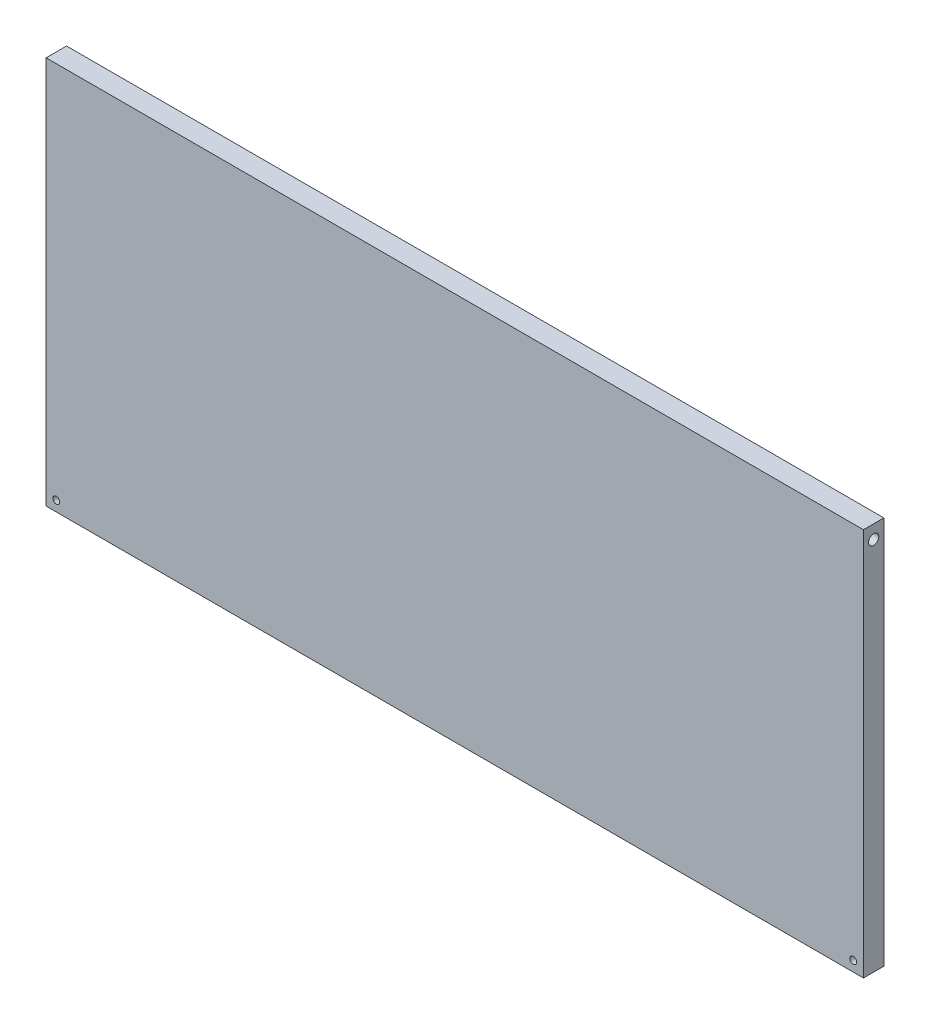
ISO-10303-21;
HEADER;
FILE_DESCRIPTION(('STEP AP214'),'2;1');
FILE_NAME('part.step','',(''),(''),'','','');
FILE_SCHEMA(('AUTOMOTIVE_DESIGN { 1 0 10303 214 1 1 1 1 }'));
ENDSEC;
DATA;
#1=APPLICATION_CONTEXT('core data for automotive mechanical design processes');
#2=APPLICATION_PROTOCOL_DEFINITION('international standard','automotive_design',2000,#1);
#3=PRODUCT_CONTEXT('',#1,'mechanical');
#4=PRODUCT('Part','Part','',(#3));
#5=PRODUCT_RELATED_PRODUCT_CATEGORY('part','',(#4));
#6=PRODUCT_DEFINITION_FORMATION('','',#4);
#7=PRODUCT_DEFINITION_CONTEXT('part definition',#1,'design');
#8=PRODUCT_DEFINITION('design','',#6,#7);
#9=PRODUCT_DEFINITION_SHAPE('','',#8);
#10=(LENGTH_UNIT() NAMED_UNIT(*) SI_UNIT(.MILLI.,.METRE.));
#11=(NAMED_UNIT(*) PLANE_ANGLE_UNIT() SI_UNIT($,.RADIAN.));
#12=(NAMED_UNIT(*) SI_UNIT($,.STERADIAN.) SOLID_ANGLE_UNIT());
#13=UNCERTAINTY_MEASURE_WITH_UNIT(LENGTH_MEASURE(1.E-05),#10,'distance_accuracy_value','');
#14=(GEOMETRIC_REPRESENTATION_CONTEXT(3) GLOBAL_UNCERTAINTY_ASSIGNED_CONTEXT((#13)) GLOBAL_UNIT_ASSIGNED_CONTEXT((#10,
#11,#12)) REPRESENTATION_CONTEXT('',''));
#15=CARTESIAN_POINT('',(0.,0.,0.));
#16=DIRECTION('',(0.,0.,1.));
#17=DIRECTION('',(1.,0.,0.));
#18=AXIS2_PLACEMENT_3D('',#15,#16,#17);
#19=CARTESIAN_POINT('',(0.,0.,3.));
#20=DIRECTION('',(1.,0.,0.));
#21=DIRECTION('',(0.,0.,-1.));
#22=AXIS2_PLACEMENT_3D('',#19,#20,#21);
#23=PLANE('',#22);
#24=CARTESIAN_POINT('',(0.,55.,1.5));
#25=DIRECTION('',(1.,0.,0.));
#26=DIRECTION('',(0.,0.,-1.));
#27=AXIS2_PLACEMENT_3D('',#24,#25,#26);
#28=CIRCLE('',#27,0.750000000000001);
#29=CARTESIAN_POINT('',(0.,55.,0.749999999999999));
#30=VERTEX_POINT('',#29);
#31=EDGE_CURVE('E113',#30,#30,#28,.T.);
#32=ORIENTED_EDGE('',*,*,#31,.T.);
#33=EDGE_LOOP('',(#32));
#34=FACE_BOUND('',#33,.T.);
#35=DIRECTION('',(0.,-1.,0.));
#36=VECTOR('',#35,1.);
#37=CARTESIAN_POINT('',(0.,0.,0.));
#38=LINE('',#37,#36);
#39=CARTESIAN_POINT('',(0.,57.,0.));
#40=VERTEX_POINT('',#39);
#41=CARTESIAN_POINT('',(0.,0.,0.));
#42=VERTEX_POINT('',#41);
#43=EDGE_CURVE('E109',#40,#42,#38,.T.);
#44=ORIENTED_EDGE('',*,*,#43,.T.);
#45=DIRECTION('',(0.,0.,-1.));
#46=VECTOR('',#45,1.);
#47=CARTESIAN_POINT('',(0.,0.,3.));
#48=LINE('',#47,#46);
#49=CARTESIAN_POINT('',(0.,0.,3.));
#50=VERTEX_POINT('',#49);
#51=EDGE_CURVE('E11',#50,#42,#48,.T.);
#52=ORIENTED_EDGE('',*,*,#51,.F.);
#53=DIRECTION('',(0.,-1.,0.));
#54=VECTOR('',#53,1.);
#55=CARTESIAN_POINT('',(0.,0.,3.));
#56=LINE('',#55,#54);
#57=CARTESIAN_POINT('',(0.,57.,3.));
#58=VERTEX_POINT('',#57);
#59=EDGE_CURVE('E92',#58,#50,#56,.T.);
#60=ORIENTED_EDGE('',*,*,#59,.F.);
#61=DIRECTION('',(0.,0.,-1.));
#62=VECTOR('',#61,1.);
#63=CARTESIAN_POINT('',(0.,57.,3.));
#64=LINE('',#63,#62);
#65=EDGE_CURVE('E105',#58,#40,#64,.T.);
#66=ORIENTED_EDGE('',*,*,#65,.T.);
#67=EDGE_LOOP('',(#44,#52,#60,#66));
#68=FACE_BOUND('',#67,.T.);
#69=ADVANCED_FACE('F38',(#34,#68),#23,.F.);
#70=CARTESIAN_POINT('',(0.,0.,3.));
#71=DIRECTION('',(0.,1.,0.));
#72=DIRECTION('',(0.,0.,1.));
#73=AXIS2_PLACEMENT_3D('',#70,#71,#72);
#74=PLANE('',#73);
#75=DIRECTION('',(1.,0.,0.));
#76=VECTOR('',#75,1.);
#77=CARTESIAN_POINT('',(0.,0.,0.));
#78=LINE('',#77,#76);
#79=CARTESIAN_POINT('',(120.,0.,0.));
#80=VERTEX_POINT('',#79);
#81=EDGE_CURVE('E97',#42,#80,#78,.T.);
#82=ORIENTED_EDGE('',*,*,#81,.T.);
#83=DIRECTION('',(0.,0.,-1.));
#84=VECTOR('',#83,1.);
#85=CARTESIAN_POINT('',(120.,0.,3.));
#86=LINE('',#85,#84);
#87=CARTESIAN_POINT('',(120.,0.,3.));
#88=VERTEX_POINT('',#87);
#89=EDGE_CURVE('E48',#88,#80,#86,.T.);
#90=ORIENTED_EDGE('',*,*,#89,.F.);
#91=DIRECTION('',(1.,0.,0.));
#92=VECTOR('',#91,1.);
#93=CARTESIAN_POINT('',(0.,0.,3.));
#94=LINE('',#93,#92);
#95=EDGE_CURVE('E87',#50,#88,#94,.T.);
#96=ORIENTED_EDGE('',*,*,#95,.F.);
#97=ORIENTED_EDGE('',*,*,#51,.T.);
#98=EDGE_LOOP('',(#82,#90,#96,#97));
#99=FACE_BOUND('',#98,.T.);
#100=ADVANCED_FACE('F96',(#99),#74,.F.);
#101=CARTESIAN_POINT('',(120.,0.,3.));
#102=DIRECTION('',(-1.,0.,0.));
#103=DIRECTION('',(0.,0.,1.));
#104=AXIS2_PLACEMENT_3D('',#101,#102,#103);
#105=PLANE('',#104);
#106=CARTESIAN_POINT('',(120.,55.,1.5));
#107=DIRECTION('',(1.,0.,0.));
#108=DIRECTION('',(0.,0.,-1.));
#109=AXIS2_PLACEMENT_3D('',#106,#107,#108);
#110=CIRCLE('',#109,0.750000000000001);
#111=CARTESIAN_POINT('',(120.,55.,0.749999999999999));
#112=VERTEX_POINT('',#111);
#113=EDGE_CURVE('E132',#112,#112,#110,.T.);
#114=ORIENTED_EDGE('',*,*,#113,.F.);
#115=EDGE_LOOP('',(#114));
#116=FACE_BOUND('',#115,.T.);
#117=DIRECTION('',(0.,1.,0.));
#118=VECTOR('',#117,1.);
#119=CARTESIAN_POINT('',(120.,0.,0.));
#120=LINE('',#119,#118);
#121=CARTESIAN_POINT('',(120.,57.,0.));
#122=VERTEX_POINT('',#121);
#123=EDGE_CURVE('E74',#80,#122,#120,.T.);
#124=ORIENTED_EDGE('',*,*,#123,.T.);
#125=DIRECTION('',(0.,0.,-1.));
#126=VECTOR('',#125,1.);
#127=CARTESIAN_POINT('',(120.,57.,3.));
#128=LINE('',#127,#126);
#129=CARTESIAN_POINT('',(120.,57.,3.));
#130=VERTEX_POINT('',#129);
#131=EDGE_CURVE('E99',#130,#122,#128,.T.);
#132=ORIENTED_EDGE('',*,*,#131,.F.);
#133=DIRECTION('',(0.,1.,0.));
#134=VECTOR('',#133,1.);
#135=CARTESIAN_POINT('',(120.,0.,3.));
#136=LINE('',#135,#134);
#137=EDGE_CURVE('E90',#88,#130,#136,.T.);
#138=ORIENTED_EDGE('',*,*,#137,.F.);
#139=ORIENTED_EDGE('',*,*,#89,.T.);
#140=EDGE_LOOP('',(#124,#132,#138,#139));
#141=FACE_BOUND('',#140,.T.);
#142=ADVANCED_FACE('F101',(#116,#141),#105,.F.);
#143=CARTESIAN_POINT('',(0.,57.,3.));
#144=DIRECTION('',(0.,-1.,0.));
#145=DIRECTION('',(0.,0.,-1.));
#146=AXIS2_PLACEMENT_3D('',#143,#144,#145);
#147=PLANE('',#146);
#148=DIRECTION('',(-1.,0.,0.));
#149=VECTOR('',#148,1.);
#150=CARTESIAN_POINT('',(0.,57.,0.));
#151=LINE('',#150,#149);
#152=EDGE_CURVE('E80',#122,#40,#151,.T.);
#153=ORIENTED_EDGE('',*,*,#152,.T.);
#154=ORIENTED_EDGE('',*,*,#65,.F.);
#155=DIRECTION('',(-1.,0.,0.));
#156=VECTOR('',#155,1.);
#157=CARTESIAN_POINT('',(0.,57.,3.));
#158=LINE('',#157,#156);
#159=EDGE_CURVE('E57',#130,#58,#158,.T.);
#160=ORIENTED_EDGE('',*,*,#159,.F.);
#161=ORIENTED_EDGE('',*,*,#131,.T.);
#162=EDGE_LOOP('',(#153,#154,#160,#161));
#163=FACE_BOUND('',#162,.T.);
#164=ADVANCED_FACE('F175',(#163),#147,.F.);
#165=CARTESIAN_POINT('',(0.,0.,3.));
#166=DIRECTION('',(0.,0.,-1.));
#167=DIRECTION('',(-1.,0.,0.));
#168=AXIS2_PLACEMENT_3D('',#165,#166,#167);
#169=PLANE('',#168);
#170=CARTESIAN_POINT('',(1.5,1.5,3.));
#171=DIRECTION('',(0.,0.,1.));
#172=DIRECTION('',(1.,0.,0.));
#173=AXIS2_PLACEMENT_3D('',#170,#171,#172);
#174=CIRCLE('',#173,0.5);
#175=CARTESIAN_POINT('',(2.,1.5,3.));
#176=VERTEX_POINT('',#175);
#177=EDGE_CURVE('E126',#176,#176,#174,.T.);
#178=ORIENTED_EDGE('',*,*,#177,.F.);
#179=EDGE_LOOP('',(#178));
#180=FACE_BOUND('',#179,.T.);
#181=CARTESIAN_POINT('',(118.5,1.5,3.));
#182=DIRECTION('',(0.,0.,1.));
#183=DIRECTION('',(1.,0.,0.));
#184=AXIS2_PLACEMENT_3D('',#181,#182,#183);
#185=CIRCLE('',#184,0.499999999999999);
#186=CARTESIAN_POINT('',(119.,1.5,3.));
#187=VERTEX_POINT('',#186);
#188=EDGE_CURVE('E134',#187,#187,#185,.T.);
#189=ORIENTED_EDGE('',*,*,#188,.F.);
#190=EDGE_LOOP('',(#189));
#191=FACE_BOUND('',#190,.T.);
#192=ORIENTED_EDGE('',*,*,#59,.T.);
#193=ORIENTED_EDGE('',*,*,#95,.T.);
#194=ORIENTED_EDGE('',*,*,#137,.T.);
#195=ORIENTED_EDGE('',*,*,#159,.T.);
#196=EDGE_LOOP('',(#192,#193,#194,#195));
#197=FACE_BOUND('',#196,.T.);
#198=ADVANCED_FACE('F88',(#180,#191,#197),#169,.F.);
#199=CARTESIAN_POINT('',(0.,0.,0.));
#200=DIRECTION('',(0.,0.,-1.));
#201=DIRECTION('',(-1.,0.,0.));
#202=AXIS2_PLACEMENT_3D('',#199,#200,#201);
#203=PLANE('',#202);
#204=CARTESIAN_POINT('',(1.5,1.5,0.));
#205=DIRECTION('',(0.,0.,-1.));
#206=DIRECTION('',(-1.,0.,0.));
#207=AXIS2_PLACEMENT_3D('',#204,#205,#206);
#208=CIRCLE('',#207,0.5);
#209=CARTESIAN_POINT('',(1.,1.5,0.));
#210=VERTEX_POINT('',#209);
#211=EDGE_CURVE('E41',#210,#210,#208,.T.);
#212=ORIENTED_EDGE('',*,*,#211,.F.);
#213=EDGE_LOOP('',(#212));
#214=FACE_BOUND('',#213,.T.);
#215=CARTESIAN_POINT('',(118.5,1.5,0.));
#216=DIRECTION('',(0.,0.,-1.));
#217=DIRECTION('',(-1.,0.,0.));
#218=AXIS2_PLACEMENT_3D('',#215,#216,#217);
#219=CIRCLE('',#218,0.499999999999999);
#220=CARTESIAN_POINT('',(118.,1.5,0.));
#221=VERTEX_POINT('',#220);
#222=EDGE_CURVE('E123',#221,#221,#219,.T.);
#223=ORIENTED_EDGE('',*,*,#222,.F.);
#224=EDGE_LOOP('',(#223));
#225=FACE_BOUND('',#224,.T.);
#226=ORIENTED_EDGE('',*,*,#43,.F.);
#227=ORIENTED_EDGE('',*,*,#152,.F.);
#228=ORIENTED_EDGE('',*,*,#123,.F.);
#229=ORIENTED_EDGE('',*,*,#81,.F.);
#230=EDGE_LOOP('',(#226,#227,#228,#229));
#231=FACE_BOUND('',#230,.T.);
#232=ADVANCED_FACE('F155',(#214,#225,#231),#203,.T.);
#233=CARTESIAN_POINT('',(-4.00000000000003,55.,1.5));
#234=DIRECTION('',(1.,0.,0.));
#235=DIRECTION('',(0.,0.,-1.));
#236=AXIS2_PLACEMENT_3D('',#233,#234,#235);
#237=CYLINDRICAL_SURFACE('',#236,0.750000000000001);
#238=ORIENTED_EDGE('',*,*,#113,.T.);
#239=EDGE_LOOP('',(#238));
#240=FACE_BOUND('',#239,.T.);
#241=ORIENTED_EDGE('',*,*,#31,.F.);
#242=EDGE_LOOP('',(#241));
#243=FACE_BOUND('',#242,.T.);
#244=ADVANCED_FACE('F152',(#240,#243),#237,.F.);
#245=CARTESIAN_POINT('',(118.5,1.5,-7.));
#246=DIRECTION('',(0.,0.,1.));
#247=DIRECTION('',(1.,0.,0.));
#248=AXIS2_PLACEMENT_3D('',#245,#246,#247);
#249=CYLINDRICAL_SURFACE('',#248,0.499999999999999);
#250=ORIENTED_EDGE('',*,*,#222,.T.);
#251=EDGE_LOOP('',(#250));
#252=FACE_BOUND('',#251,.T.);
#253=ORIENTED_EDGE('',*,*,#188,.T.);
#254=EDGE_LOOP('',(#253));
#255=FACE_BOUND('',#254,.T.);
#256=ADVANCED_FACE('F154',(#252,#255),#249,.F.);
#257=CARTESIAN_POINT('',(1.5,1.5,-7.));
#258=DIRECTION('',(0.,0.,1.));
#259=DIRECTION('',(1.,0.,0.));
#260=AXIS2_PLACEMENT_3D('',#257,#258,#259);
#261=CYLINDRICAL_SURFACE('',#260,0.5);
#262=ORIENTED_EDGE('',*,*,#211,.T.);
#263=EDGE_LOOP('',(#262));
#264=FACE_BOUND('',#263,.T.);
#265=ORIENTED_EDGE('',*,*,#177,.T.);
#266=EDGE_LOOP('',(#265));
#267=FACE_BOUND('',#266,.T.);
#268=ADVANCED_FACE('F162',(#264,#267),#261,.F.);
#269=CLOSED_SHELL('',(#69,#100,#142,#164,#198,#232,#244,#256,#268));
#270=MANIFOLD_SOLID_BREP('B2',#269);
#271=ADVANCED_BREP_SHAPE_REPRESENTATION('',(#18,#270),#14);
#272=SHAPE_DEFINITION_REPRESENTATION(#9,#271);
ENDSEC;
END-ISO-10303-21;
